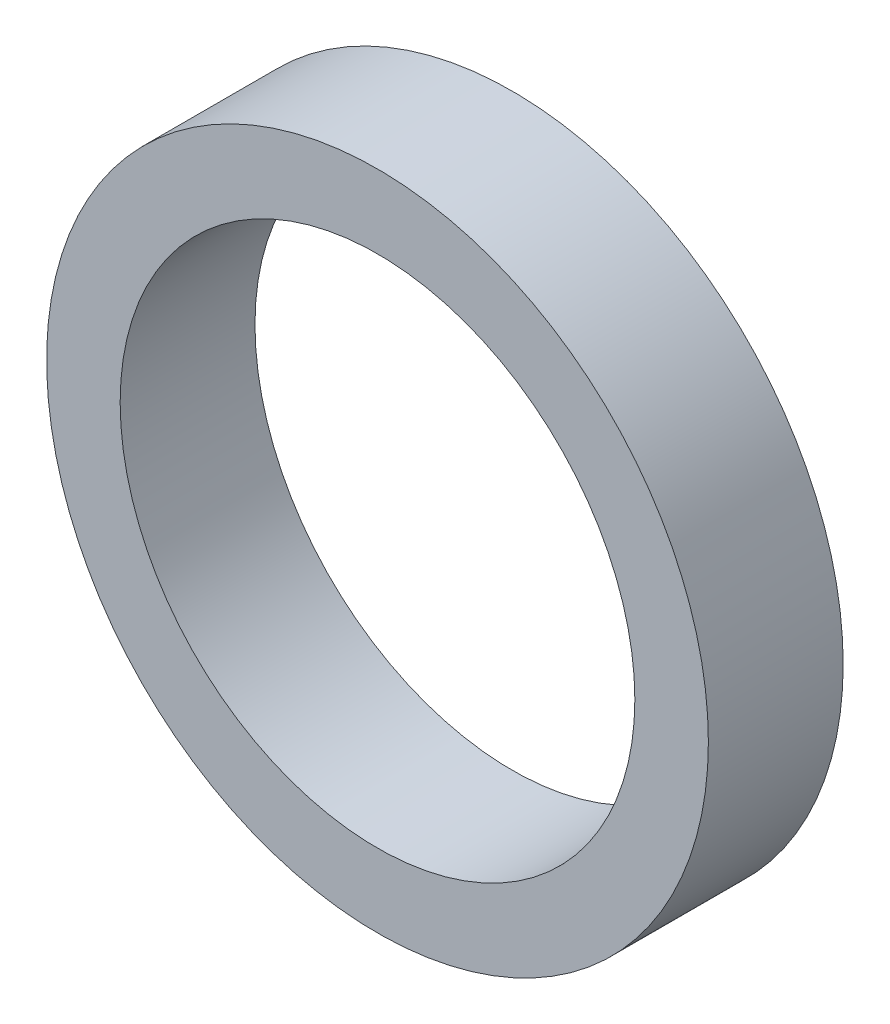
ISO-10303-21;
HEADER;
FILE_DESCRIPTION(('STEP AP214'),'2;1');
FILE_NAME('part.step','',(''),(''),'','','');
FILE_SCHEMA(('AUTOMOTIVE_DESIGN { 1 0 10303 214 1 1 1 1 }'));
ENDSEC;
DATA;
#1=APPLICATION_CONTEXT('core data for automotive mechanical design processes');
#2=APPLICATION_PROTOCOL_DEFINITION('international standard','automotive_design',2000,#1);
#3=PRODUCT_CONTEXT('',#1,'mechanical');
#4=PRODUCT('Part','Part','',(#3));
#5=PRODUCT_RELATED_PRODUCT_CATEGORY('part','',(#4));
#6=PRODUCT_DEFINITION_FORMATION('','',#4);
#7=PRODUCT_DEFINITION_CONTEXT('part definition',#1,'design');
#8=PRODUCT_DEFINITION('design','',#6,#7);
#9=PRODUCT_DEFINITION_SHAPE('','',#8);
#10=(LENGTH_UNIT() NAMED_UNIT(*) SI_UNIT(.MILLI.,.METRE.));
#11=(NAMED_UNIT(*) PLANE_ANGLE_UNIT() SI_UNIT($,.RADIAN.));
#12=(NAMED_UNIT(*) SI_UNIT($,.STERADIAN.) SOLID_ANGLE_UNIT());
#13=UNCERTAINTY_MEASURE_WITH_UNIT(LENGTH_MEASURE(1.E-05),#10,'distance_accuracy_value','');
#14=(GEOMETRIC_REPRESENTATION_CONTEXT(3) GLOBAL_UNCERTAINTY_ASSIGNED_CONTEXT((#13)) GLOBAL_UNIT_ASSIGNED_CONTEXT((#10,
#11,#12)) REPRESENTATION_CONTEXT('',''));
#15=CARTESIAN_POINT('',(0.,0.,0.));
#16=DIRECTION('',(0.,0.,1.));
#17=DIRECTION('',(1.,0.,0.));
#18=AXIS2_PLACEMENT_3D('',#15,#16,#17);
#19=CARTESIAN_POINT('',(0.,10.5,0.));
#20=DIRECTION('',(0.,0.,-1.));
#21=DIRECTION('',(0.,-1.,0.));
#22=AXIS2_PLACEMENT_3D('',#19,#20,#21);
#23=PLANE('',#22);
#24=CARTESIAN_POINT('',(0.,0.,0.));
#25=DIRECTION('',(0.,0.,-1.));
#26=DIRECTION('',(-1.,0.,0.));
#27=AXIS2_PLACEMENT_3D('',#24,#25,#26);
#28=CIRCLE('',#27,10.5);
#29=CARTESIAN_POINT('',(10.5,0.,0.));
#30=VERTEX_POINT('',#29);
#31=EDGE_CURVE('E25',#30,#30,#28,.T.);
#32=ORIENTED_EDGE('',*,*,#31,.F.);
#33=EDGE_LOOP('',(#32));
#34=FACE_BOUND('',#33,.T.);
#35=CARTESIAN_POINT('',(0.,0.,0.));
#36=DIRECTION('',(0.,0.,-1.));
#37=DIRECTION('',(-1.,0.,0.));
#38=AXIS2_PLACEMENT_3D('',#35,#36,#37);
#39=CIRCLE('',#38,13.5);
#40=CARTESIAN_POINT('',(13.5,0.,0.));
#41=VERTEX_POINT('',#40);
#42=EDGE_CURVE('E57',#41,#41,#39,.T.);
#43=ORIENTED_EDGE('',*,*,#42,.T.);
#44=EDGE_LOOP('',(#43));
#45=FACE_BOUND('',#44,.T.);
#46=ADVANCED_FACE('F17',(#34,#45),#23,.T.);
#47=CARTESIAN_POINT('',(0.,0.,-50.));
#48=DIRECTION('',(0.,0.,1.));
#49=DIRECTION('',(-1.,0.,0.));
#50=AXIS2_PLACEMENT_3D('',#47,#48,#49);
#51=CYLINDRICAL_SURFACE('',#50,10.5);
#52=ORIENTED_EDGE('',*,*,#31,.T.);
#53=DIRECTION('',(0.,0.,1.));
#54=VECTOR('',#53,1.);
#55=CARTESIAN_POINT('',(10.5,0.,-50.));
#56=LINE('',#55,#54);
#57=CARTESIAN_POINT('',(10.5,0.,5.5));
#58=VERTEX_POINT('',#57);
#59=EDGE_CURVE('E11',#30,#58,#56,.T.);
#60=ORIENTED_EDGE('',*,*,#59,.T.);
#61=CARTESIAN_POINT('',(0.,0.,5.5));
#62=DIRECTION('',(0.,0.,-1.));
#63=DIRECTION('',(-1.,0.,0.));
#64=AXIS2_PLACEMENT_3D('',#61,#62,#63);
#65=CIRCLE('',#64,10.5);
#66=EDGE_CURVE('E63',#58,#58,#65,.T.);
#67=ORIENTED_EDGE('',*,*,#66,.F.);
#68=ORIENTED_EDGE('',*,*,#59,.F.);
#69=EDGE_LOOP('',(#52,#60,#67,#68));
#70=FACE_BOUND('',#69,.T.);
#71=ADVANCED_FACE('F73',(#70),#51,.F.);
#72=CARTESIAN_POINT('',(0.,13.5,5.5));
#73=DIRECTION('',(0.,0.,1.));
#74=DIRECTION('',(1.,0.,0.));
#75=AXIS2_PLACEMENT_3D('',#72,#73,#74);
#76=PLANE('',#75);
#77=ORIENTED_EDGE('',*,*,#66,.T.);
#78=EDGE_LOOP('',(#77));
#79=FACE_BOUND('',#78,.T.);
#80=CARTESIAN_POINT('',(0.,0.,5.5));
#81=DIRECTION('',(0.,0.,-1.));
#82=DIRECTION('',(-1.,0.,0.));
#83=AXIS2_PLACEMENT_3D('',#80,#81,#82);
#84=CIRCLE('',#83,13.5);
#85=CARTESIAN_POINT('',(13.5,0.,5.5));
#86=VERTEX_POINT('',#85);
#87=EDGE_CURVE('E54',#86,#86,#84,.T.);
#88=ORIENTED_EDGE('',*,*,#87,.F.);
#89=EDGE_LOOP('',(#88));
#90=FACE_BOUND('',#89,.T.);
#91=ADVANCED_FACE('F85',(#79,#90),#76,.T.);
#92=CARTESIAN_POINT('',(0.,0.,-50.));
#93=DIRECTION('',(0.,0.,1.));
#94=DIRECTION('',(-1.,0.,0.));
#95=AXIS2_PLACEMENT_3D('',#92,#93,#94);
#96=CYLINDRICAL_SURFACE('',#95,13.5);
#97=ORIENTED_EDGE('',*,*,#87,.T.);
#98=DIRECTION('',(0.,0.,-1.));
#99=VECTOR('',#98,1.);
#100=CARTESIAN_POINT('',(13.5,0.,-50.));
#101=LINE('',#100,#99);
#102=EDGE_CURVE('E55',#86,#41,#101,.T.);
#103=ORIENTED_EDGE('',*,*,#102,.T.);
#104=ORIENTED_EDGE('',*,*,#42,.F.);
#105=ORIENTED_EDGE('',*,*,#102,.F.);
#106=EDGE_LOOP('',(#97,#103,#104,#105));
#107=FACE_BOUND('',#106,.T.);
#108=ADVANCED_FACE('F52',(#107),#96,.T.);
#109=CLOSED_SHELL('',(#46,#71,#91,#108));
#110=MANIFOLD_SOLID_BREP('B1',#109);
#111=ADVANCED_BREP_SHAPE_REPRESENTATION('',(#18,#110),#14);
#112=SHAPE_DEFINITION_REPRESENTATION(#9,#111);
ENDSEC;
END-ISO-10303-21;
